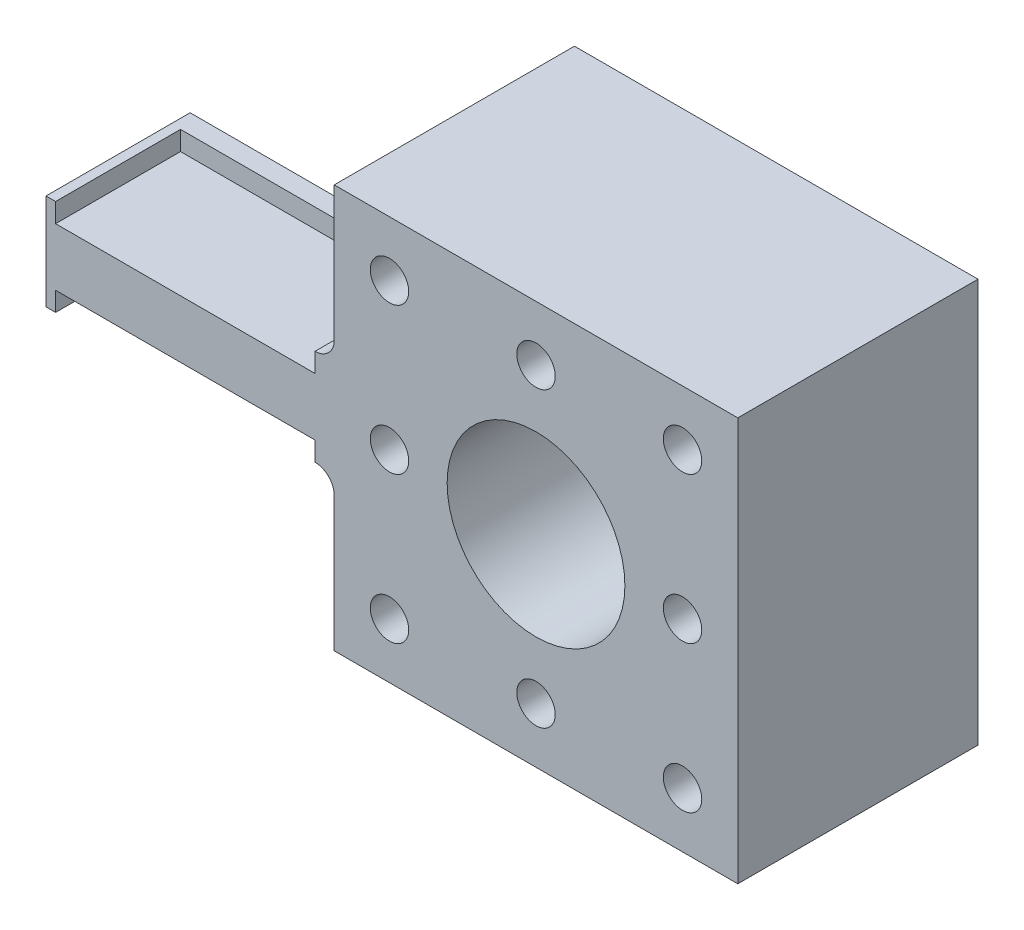
ISO-10303-21;
HEADER;
FILE_DESCRIPTION(('STEP AP214'),'2;1');
FILE_NAME('part.step','',(''),(''),'','','');
FILE_SCHEMA(('AUTOMOTIVE_DESIGN { 1 0 10303 214 1 1 1 1 }'));
ENDSEC;
DATA;
#1=APPLICATION_CONTEXT('core data for automotive mechanical design processes');
#2=APPLICATION_PROTOCOL_DEFINITION('international standard','automotive_design',2000,#1);
#3=PRODUCT_CONTEXT('',#1,'mechanical');
#4=PRODUCT('Part','Part','',(#3));
#5=PRODUCT_RELATED_PRODUCT_CATEGORY('part','',(#4));
#6=PRODUCT_DEFINITION_FORMATION('','',#4);
#7=PRODUCT_DEFINITION_CONTEXT('part definition',#1,'design');
#8=PRODUCT_DEFINITION('design','',#6,#7);
#9=PRODUCT_DEFINITION_SHAPE('','',#8);
#10=(LENGTH_UNIT() NAMED_UNIT(*) SI_UNIT(.MILLI.,.METRE.));
#11=(NAMED_UNIT(*) PLANE_ANGLE_UNIT() SI_UNIT($,.RADIAN.));
#12=(NAMED_UNIT(*) SI_UNIT($,.STERADIAN.) SOLID_ANGLE_UNIT());
#13=UNCERTAINTY_MEASURE_WITH_UNIT(LENGTH_MEASURE(1.E-05),#10,'distance_accuracy_value','');
#14=(GEOMETRIC_REPRESENTATION_CONTEXT(3) GLOBAL_UNCERTAINTY_ASSIGNED_CONTEXT((#13)) GLOBAL_UNIT_ASSIGNED_CONTEXT((#10,
#11,#12)) REPRESENTATION_CONTEXT('',''));
#15=CARTESIAN_POINT('',(0.,0.,0.));
#16=DIRECTION('',(0.,0.,1.));
#17=DIRECTION('',(1.,0.,0.));
#18=AXIS2_PLACEMENT_3D('',#15,#16,#17);
#19=CARTESIAN_POINT('',(0.,0.,25.));
#20=DIRECTION('',(1.,0.,0.));
#21=DIRECTION('',(0.,1.,0.));
#22=AXIS2_PLACEMENT_3D('',#19,#20,#21);
#23=PLANE('',#22);
#24=DIRECTION('',(0.,-1.,0.));
#25=VECTOR('',#24,1.);
#26=CARTESIAN_POINT('',(0.,-16.,10.));
#27=LINE('',#26,#25);
#28=CARTESIAN_POINT('',(0.,-14.,10.));
#29=VERTEX_POINT('',#28);
#30=CARTESIAN_POINT('',(0.,-28.,10.));
#31=VERTEX_POINT('',#30);
#32=EDGE_CURVE('E52',#29,#31,#27,.T.);
#33=ORIENTED_EDGE('',*,*,#32,.F.);
#34=DIRECTION('',(0.,0.,-1.));
#35=VECTOR('',#34,1.);
#36=CARTESIAN_POINT('',(0.,-14.,25.));
#37=LINE('',#36,#35);
#38=CARTESIAN_POINT('',(0.,-14.,25.));
#39=VERTEX_POINT('',#38);
#40=EDGE_CURVE('E333',#29,#39,#37,.F.);
#41=ORIENTED_EDGE('',*,*,#40,.T.);
#42=DIRECTION('',(0.,-1.,0.));
#43=VECTOR('',#42,1.);
#44=CARTESIAN_POINT('',(0.,0.,25.));
#45=LINE('',#44,#43);
#46=CARTESIAN_POINT('',(0.,0.,25.));
#47=VERTEX_POINT('',#46);
#48=EDGE_CURVE('E299',#47,#39,#45,.T.);
#49=ORIENTED_EDGE('',*,*,#48,.F.);
#50=DIRECTION('',(0.,0.,-1.));
#51=VECTOR('',#50,1.);
#52=CARTESIAN_POINT('',(0.,0.,25.));
#53=LINE('',#52,#51);
#54=CARTESIAN_POINT('',(0.,0.,0.));
#55=VERTEX_POINT('',#54);
#56=EDGE_CURVE('E309',#47,#55,#53,.T.);
#57=ORIENTED_EDGE('',*,*,#56,.T.);
#58=DIRECTION('',(0.,-1.,0.));
#59=VECTOR('',#58,1.);
#60=CARTESIAN_POINT('',(0.,0.,0.));
#61=LINE('',#60,#59);
#62=CARTESIAN_POINT('',(0.,-42.,0.));
#63=VERTEX_POINT('',#62);
#64=EDGE_CURVE('E296',#55,#63,#61,.T.);
#65=ORIENTED_EDGE('',*,*,#64,.T.);
#66=DIRECTION('',(0.,0.,-1.));
#67=VECTOR('',#66,1.);
#68=CARTESIAN_POINT('',(0.,-42.,25.));
#69=LINE('',#68,#67);
#70=CARTESIAN_POINT('',(0.,-42.,25.));
#71=VERTEX_POINT('',#70);
#72=EDGE_CURVE('E326',#71,#63,#69,.T.);
#73=ORIENTED_EDGE('',*,*,#72,.F.);
#74=CARTESIAN_POINT('',(0.,-28.,25.));
#75=VERTEX_POINT('',#74);
#76=EDGE_CURVE('E303',#75,#71,#45,.T.);
#77=ORIENTED_EDGE('',*,*,#76,.F.);
#78=DIRECTION('',(0.,0.,1.));
#79=VECTOR('',#78,1.);
#80=CARTESIAN_POINT('',(0.,-28.,10.));
#81=LINE('',#80,#79);
#82=EDGE_CURVE('E331',#75,#31,#81,.F.);
#83=ORIENTED_EDGE('',*,*,#82,.T.);
#84=EDGE_LOOP('',(#33,#41,#49,#57,#65,#73,#77,#83));
#85=FACE_BOUND('',#84,.T.);
#86=ADVANCED_FACE('F32',(#85),#23,.F.);
#87=CARTESIAN_POINT('',(0.,-42.,25.));
#88=DIRECTION('',(0.,1.,0.));
#89=DIRECTION('',(0.,0.,1.));
#90=AXIS2_PLACEMENT_3D('',#87,#88,#89);
#91=PLANE('',#90);
#92=DIRECTION('',(1.,0.,0.));
#93=VECTOR('',#92,1.);
#94=CARTESIAN_POINT('',(0.,-42.,0.));
#95=LINE('',#94,#93);
#96=CARTESIAN_POINT('',(42.,-42.,0.));
#97=VERTEX_POINT('',#96);
#98=EDGE_CURVE('E312',#63,#97,#95,.T.);
#99=ORIENTED_EDGE('',*,*,#98,.T.);
#100=DIRECTION('',(0.,0.,-1.));
#101=VECTOR('',#100,1.);
#102=CARTESIAN_POINT('',(42.,-42.,25.));
#103=LINE('',#102,#101);
#104=CARTESIAN_POINT('',(42.,-42.,25.));
#105=VERTEX_POINT('',#104);
#106=EDGE_CURVE('E323',#105,#97,#103,.T.);
#107=ORIENTED_EDGE('',*,*,#106,.F.);
#108=DIRECTION('',(1.,0.,0.));
#109=VECTOR('',#108,1.);
#110=CARTESIAN_POINT('',(0.,-42.,25.));
#111=LINE('',#110,#109);
#112=EDGE_CURVE('E302',#71,#105,#111,.T.);
#113=ORIENTED_EDGE('',*,*,#112,.F.);
#114=ORIENTED_EDGE('',*,*,#72,.T.);
#115=EDGE_LOOP('',(#99,#107,#113,#114));
#116=FACE_BOUND('',#115,.T.);
#117=ADVANCED_FACE('F381',(#116),#91,.F.);
#118=CARTESIAN_POINT('',(42.,0.,25.));
#119=DIRECTION('',(-1.,0.,0.));
#120=DIRECTION('',(0.,-1.,0.));
#121=AXIS2_PLACEMENT_3D('',#118,#119,#120);
#122=PLANE('',#121);
#123=DIRECTION('',(0.,1.,0.));
#124=VECTOR('',#123,1.);
#125=CARTESIAN_POINT('',(42.,0.,0.));
#126=LINE('',#125,#124);
#127=CARTESIAN_POINT('',(42.,0.,0.));
#128=VERTEX_POINT('',#127);
#129=EDGE_CURVE('E314',#97,#128,#126,.T.);
#130=ORIENTED_EDGE('',*,*,#129,.T.);
#131=DIRECTION('',(0.,0.,-1.));
#132=VECTOR('',#131,1.);
#133=CARTESIAN_POINT('',(42.,0.,25.));
#134=LINE('',#133,#132);
#135=CARTESIAN_POINT('',(42.,0.,25.));
#136=VERTEX_POINT('',#135);
#137=EDGE_CURVE('E320',#136,#128,#134,.T.);
#138=ORIENTED_EDGE('',*,*,#137,.F.);
#139=DIRECTION('',(0.,1.,0.));
#140=VECTOR('',#139,1.);
#141=CARTESIAN_POINT('',(42.,0.,25.));
#142=LINE('',#141,#140);
#143=EDGE_CURVE('E305',#105,#136,#142,.T.);
#144=ORIENTED_EDGE('',*,*,#143,.F.);
#145=ORIENTED_EDGE('',*,*,#106,.T.);
#146=EDGE_LOOP('',(#130,#138,#144,#145));
#147=FACE_BOUND('',#146,.T.);
#148=ADVANCED_FACE('F386',(#147),#122,.F.);
#149=CARTESIAN_POINT('',(0.,0.,25.));
#150=DIRECTION('',(0.,-1.,0.));
#151=DIRECTION('',(0.,0.,-1.));
#152=AXIS2_PLACEMENT_3D('',#149,#150,#151);
#153=PLANE('',#152);
#154=DIRECTION('',(-1.,0.,0.));
#155=VECTOR('',#154,1.);
#156=CARTESIAN_POINT('',(0.,0.,0.));
#157=LINE('',#156,#155);
#158=EDGE_CURVE('E316',#128,#55,#157,.T.);
#159=ORIENTED_EDGE('',*,*,#158,.T.);
#160=ORIENTED_EDGE('',*,*,#56,.F.);
#161=DIRECTION('',(-1.,0.,0.));
#162=VECTOR('',#161,1.);
#163=CARTESIAN_POINT('',(0.,0.,25.));
#164=LINE('',#163,#162);
#165=EDGE_CURVE('E307',#136,#47,#164,.T.);
#166=ORIENTED_EDGE('',*,*,#165,.F.);
#167=ORIENTED_EDGE('',*,*,#137,.T.);
#168=EDGE_LOOP('',(#159,#160,#166,#167));
#169=FACE_BOUND('',#168,.T.);
#170=ADVANCED_FACE('F478',(#169),#153,.F.);
#171=CARTESIAN_POINT('',(0.,0.,25.));
#172=DIRECTION('',(0.,0.,1.));
#173=DIRECTION('',(1.,0.,0.));
#174=AXIS2_PLACEMENT_3D('',#171,#172,#173);
#175=PLANE('',#174);
#176=DIRECTION('',(0.,1.,0.));
#177=VECTOR('',#176,1.);
#178=CARTESIAN_POINT('',(-29.,-18.,25.));
#179=LINE('',#178,#177);
#180=CARTESIAN_POINT('',(-29.,-18.,25.));
#181=VERTEX_POINT('',#180);
#182=CARTESIAN_POINT('',(-29.,-16.,25.));
#183=VERTEX_POINT('',#182);
#184=EDGE_CURVE('E150',#181,#183,#179,.T.);
#185=ORIENTED_EDGE('',*,*,#184,.T.);
#186=DIRECTION('',(1.,0.,0.));
#187=VECTOR('',#186,1.);
#188=CARTESIAN_POINT('',(-30.,-16.,25.));
#189=LINE('',#188,#187);
#190=CARTESIAN_POINT('',(-30.,-16.,25.));
#191=VERTEX_POINT('',#190);
#192=EDGE_CURVE('E242',#191,#183,#189,.T.);
#193=ORIENTED_EDGE('',*,*,#192,.F.);
#194=DIRECTION('',(0.,1.,0.));
#195=VECTOR('',#194,1.);
#196=CARTESIAN_POINT('',(-30.,-16.,25.));
#197=LINE('',#196,#195);
#198=CARTESIAN_POINT('',(-30.,-26.,25.));
#199=VERTEX_POINT('',#198);
#200=EDGE_CURVE('E223',#199,#191,#197,.T.);
#201=ORIENTED_EDGE('',*,*,#200,.F.);
#202=DIRECTION('',(1.,0.,0.));
#203=VECTOR('',#202,1.);
#204=CARTESIAN_POINT('',(-30.,-26.,25.));
#205=LINE('',#204,#203);
#206=CARTESIAN_POINT('',(-29.,-26.,25.));
#207=VERTEX_POINT('',#206);
#208=EDGE_CURVE('E233',#199,#207,#205,.T.);
#209=ORIENTED_EDGE('',*,*,#208,.T.);
#210=DIRECTION('',(0.,-1.,0.));
#211=VECTOR('',#210,1.);
#212=CARTESIAN_POINT('',(-29.,-24.,25.));
#213=LINE('',#212,#211);
#214=CARTESIAN_POINT('',(-29.,-24.,25.));
#215=VERTEX_POINT('',#214);
#216=EDGE_CURVE('E219',#215,#207,#213,.T.);
#217=ORIENTED_EDGE('',*,*,#216,.F.);
#218=DIRECTION('',(-1.,0.,0.));
#219=VECTOR('',#218,1.);
#220=CARTESIAN_POINT('',(-2.,-24.,25.));
#221=LINE('',#220,#219);
#222=CARTESIAN_POINT('',(-2.,-24.,25.));
#223=VERTEX_POINT('',#222);
#224=EDGE_CURVE('E197',#223,#215,#221,.T.);
#225=ORIENTED_EDGE('',*,*,#224,.F.);
#226=DIRECTION('',(0.,-1.,0.));
#227=VECTOR('',#226,1.);
#228=CARTESIAN_POINT('',(-2.,-24.,25.));
#229=LINE('',#228,#227);
#230=CARTESIAN_POINT('',(-2.,-26.,25.));
#231=VERTEX_POINT('',#230);
#232=EDGE_CURVE('E207',#223,#231,#229,.T.);
#233=ORIENTED_EDGE('',*,*,#232,.T.);
#234=CARTESIAN_POINT('',(-1.99999999999999,-28.,25.));
#235=DIRECTION('',(0.,0.,1.));
#236=DIRECTION('',(1.,0.,0.));
#237=AXIS2_PLACEMENT_3D('',#234,#235,#236);
#238=CIRCLE('',#237,2.);
#239=EDGE_CURVE('E40',#231,#75,#238,.F.);
#240=ORIENTED_EDGE('',*,*,#239,.T.);
#241=ORIENTED_EDGE('',*,*,#76,.T.);
#242=ORIENTED_EDGE('',*,*,#112,.T.);
#243=ORIENTED_EDGE('',*,*,#143,.T.);
#244=ORIENTED_EDGE('',*,*,#165,.T.);
#245=ORIENTED_EDGE('',*,*,#48,.T.);
#246=CARTESIAN_POINT('',(-2.,-14.,25.));
#247=DIRECTION('',(0.,0.,1.));
#248=DIRECTION('',(1.,0.,0.));
#249=AXIS2_PLACEMENT_3D('',#246,#247,#248);
#250=CIRCLE('',#249,2.);
#251=CARTESIAN_POINT('',(-2.,-16.,25.));
#252=VERTEX_POINT('',#251);
#253=EDGE_CURVE('E340',#39,#252,#250,.F.);
#254=ORIENTED_EDGE('',*,*,#253,.T.);
#255=DIRECTION('',(0.,1.,0.));
#256=VECTOR('',#255,1.);
#257=CARTESIAN_POINT('',(-2.,-18.,25.));
#258=LINE('',#257,#256);
#259=CARTESIAN_POINT('',(-2.,-18.,25.));
#260=VERTEX_POINT('',#259);
#261=EDGE_CURVE('E161',#260,#252,#258,.T.);
#262=ORIENTED_EDGE('',*,*,#261,.F.);
#263=DIRECTION('',(1.,0.,0.));
#264=VECTOR('',#263,1.);
#265=CARTESIAN_POINT('',(-29.,-18.,25.));
#266=LINE('',#265,#264);
#267=EDGE_CURVE('E168',#181,#260,#266,.T.);
#268=ORIENTED_EDGE('',*,*,#267,.F.);
#269=EDGE_LOOP('',(#185,#193,#201,#209,#217,#225,#233,#240,#241,#242,#243,#244,#245,#254,#262,#268));
#270=FACE_BOUND('',#269,.T.);
#271=CARTESIAN_POINT('',(21.,-36.25,25.));
#272=DIRECTION('',(0.,0.,1.));
#273=DIRECTION('',(1.,0.,0.));
#274=AXIS2_PLACEMENT_3D('',#271,#272,#273);
#275=CIRCLE('',#274,2.);
#276=CARTESIAN_POINT('',(23.,-36.25,25.));
#277=VERTEX_POINT('',#276);
#278=EDGE_CURVE('E261',#277,#277,#275,.T.);
#279=ORIENTED_EDGE('',*,*,#278,.F.);
#280=EDGE_LOOP('',(#279));
#281=FACE_BOUND('',#280,.T.);
#282=CARTESIAN_POINT('',(21.,-5.75000000000001,25.));
#283=DIRECTION('',(0.,0.,1.));
#284=DIRECTION('',(1.,0.,0.));
#285=AXIS2_PLACEMENT_3D('',#282,#283,#284);
#286=CIRCLE('',#285,2.);
#287=CARTESIAN_POINT('',(23.,-5.75000000000001,25.));
#288=VERTEX_POINT('',#287);
#289=EDGE_CURVE('E248',#288,#288,#286,.T.);
#290=ORIENTED_EDGE('',*,*,#289,.F.);
#291=EDGE_LOOP('',(#290));
#292=FACE_BOUND('',#291,.T.);
#293=CARTESIAN_POINT('',(36.25,-21.,25.));
#294=DIRECTION('',(0.,0.,1.));
#295=DIRECTION('',(1.,0.,0.));
#296=AXIS2_PLACEMENT_3D('',#293,#294,#295);
#297=CIRCLE('',#296,2.);
#298=CARTESIAN_POINT('',(38.25,-21.,25.));
#299=VERTEX_POINT('',#298);
#300=EDGE_CURVE('E249',#299,#299,#297,.T.);
#301=ORIENTED_EDGE('',*,*,#300,.F.);
#302=EDGE_LOOP('',(#301));
#303=FACE_BOUND('',#302,.T.);
#304=CARTESIAN_POINT('',(5.75000000000002,-21.,25.));
#305=DIRECTION('',(0.,0.,1.));
#306=DIRECTION('',(1.,0.,0.));
#307=AXIS2_PLACEMENT_3D('',#304,#305,#306);
#308=CIRCLE('',#307,2.);
#309=CARTESIAN_POINT('',(7.75000000000002,-21.,25.));
#310=VERTEX_POINT('',#309);
#311=EDGE_CURVE('E244',#310,#310,#308,.T.);
#312=ORIENTED_EDGE('',*,*,#311,.F.);
#313=EDGE_LOOP('',(#312));
#314=FACE_BOUND('',#313,.T.);
#315=CARTESIAN_POINT('',(5.75000000000002,-5.75,25.));
#316=DIRECTION('',(0.,0.,1.));
#317=DIRECTION('',(1.,0.,0.));
#318=AXIS2_PLACEMENT_3D('',#315,#316,#317);
#319=CIRCLE('',#318,2.);
#320=CARTESIAN_POINT('',(7.75000000000002,-5.75,25.));
#321=VERTEX_POINT('',#320);
#322=EDGE_CURVE('E260',#321,#321,#319,.T.);
#323=ORIENTED_EDGE('',*,*,#322,.F.);
#324=EDGE_LOOP('',(#323));
#325=FACE_BOUND('',#324,.T.);
#326=CARTESIAN_POINT('',(36.25,-5.75,25.));
#327=DIRECTION('',(0.,0.,1.));
#328=DIRECTION('',(1.,0.,0.));
#329=AXIS2_PLACEMENT_3D('',#326,#327,#328);
#330=CIRCLE('',#329,2.);
#331=CARTESIAN_POINT('',(38.25,-5.75,25.));
#332=VERTEX_POINT('',#331);
#333=EDGE_CURVE('E279',#332,#332,#330,.T.);
#334=ORIENTED_EDGE('',*,*,#333,.F.);
#335=EDGE_LOOP('',(#334));
#336=FACE_BOUND('',#335,.T.);
#337=CARTESIAN_POINT('',(5.75000000000002,-36.25,25.));
#338=DIRECTION('',(0.,0.,1.));
#339=DIRECTION('',(1.,0.,0.));
#340=AXIS2_PLACEMENT_3D('',#337,#338,#339);
#341=CIRCLE('',#340,2.00000000000001);
#342=CARTESIAN_POINT('',(7.75000000000002,-36.25,25.));
#343=VERTEX_POINT('',#342);
#344=EDGE_CURVE('E273',#343,#343,#341,.T.);
#345=ORIENTED_EDGE('',*,*,#344,.F.);
#346=EDGE_LOOP('',(#345));
#347=FACE_BOUND('',#346,.T.);
#348=CARTESIAN_POINT('',(36.25,-36.25,25.));
#349=DIRECTION('',(0.,0.,1.));
#350=DIRECTION('',(1.,0.,0.));
#351=AXIS2_PLACEMENT_3D('',#348,#349,#350);
#352=CIRCLE('',#351,2.00000000000001);
#353=CARTESIAN_POINT('',(38.25,-36.25,25.));
#354=VERTEX_POINT('',#353);
#355=EDGE_CURVE('E272',#354,#354,#352,.T.);
#356=ORIENTED_EDGE('',*,*,#355,.F.);
#357=EDGE_LOOP('',(#356));
#358=FACE_BOUND('',#357,.T.);
#359=CARTESIAN_POINT('',(21.,-21.,25.));
#360=DIRECTION('',(0.,0.,1.));
#361=DIRECTION('',(1.,0.,0.));
#362=AXIS2_PLACEMENT_3D('',#359,#360,#361);
#363=CIRCLE('',#362,9.25);
#364=CARTESIAN_POINT('',(30.25,-21.,25.));
#365=VERTEX_POINT('',#364);
#366=EDGE_CURVE('E290',#365,#365,#363,.T.);
#367=ORIENTED_EDGE('',*,*,#366,.F.);
#368=EDGE_LOOP('',(#367));
#369=FACE_BOUND('',#368,.T.);
#370=ADVANCED_FACE('F173',(#270,#281,#292,#303,#314,#325,#336,#347,#358,#369),#175,.T.);
#371=CARTESIAN_POINT('',(0.,0.,0.));
#372=DIRECTION('',(0.,0.,1.));
#373=DIRECTION('',(1.,0.,0.));
#374=AXIS2_PLACEMENT_3D('',#371,#372,#373);
#375=PLANE('',#374);
#376=CARTESIAN_POINT('',(21.,-21.,0.));
#377=DIRECTION('',(0.,0.,1.));
#378=DIRECTION('',(1.,0.,0.));
#379=AXIS2_PLACEMENT_3D('',#376,#377,#378);
#380=CIRCLE('',#379,9.25);
#381=CARTESIAN_POINT('',(30.25,-21.,0.));
#382=VERTEX_POINT('',#381);
#383=EDGE_CURVE('E293',#382,#382,#380,.T.);
#384=ORIENTED_EDGE('',*,*,#383,.T.);
#385=EDGE_LOOP('',(#384));
#386=FACE_BOUND('',#385,.T.);
#387=ORIENTED_EDGE('',*,*,#64,.F.);
#388=ORIENTED_EDGE('',*,*,#158,.F.);
#389=ORIENTED_EDGE('',*,*,#129,.F.);
#390=ORIENTED_EDGE('',*,*,#98,.F.);
#391=EDGE_LOOP('',(#387,#388,#389,#390));
#392=FACE_BOUND('',#391,.T.);
#393=ADVANCED_FACE('F477',(#386,#392),#375,.F.);
#394=CARTESIAN_POINT('',(21.,-21.,0.));
#395=DIRECTION('',(0.,0.,1.));
#396=DIRECTION('',(1.,0.,0.));
#397=AXIS2_PLACEMENT_3D('',#394,#395,#396);
#398=CYLINDRICAL_SURFACE('',#397,9.25);
#399=ORIENTED_EDGE('',*,*,#383,.F.);
#400=EDGE_LOOP('',(#399));
#401=FACE_BOUND('',#400,.T.);
#402=ORIENTED_EDGE('',*,*,#366,.T.);
#403=EDGE_LOOP('',(#402));
#404=FACE_BOUND('',#403,.T.);
#405=ADVANCED_FACE('F630',(#401,#404),#398,.F.);
#406=CARTESIAN_POINT('',(36.25,-36.25,22.));
#407=DIRECTION('',(0.,0.,1.));
#408=DIRECTION('',(1.,0.,0.));
#409=AXIS2_PLACEMENT_3D('',#406,#407,#408);
#410=CYLINDRICAL_SURFACE('',#409,2.00000000000001);
#411=CARTESIAN_POINT('',(36.25,-36.25,22.));
#412=DIRECTION('',(0.,0.,1.));
#413=DIRECTION('',(1.,0.,0.));
#414=AXIS2_PLACEMENT_3D('',#411,#412,#413);
#415=CIRCLE('',#414,2.00000000000001);
#416=CARTESIAN_POINT('',(38.25,-36.25,22.));
#417=VERTEX_POINT('',#416);
#418=EDGE_CURVE('E287',#417,#417,#415,.T.);
#419=ORIENTED_EDGE('',*,*,#418,.F.);
#420=EDGE_LOOP('',(#419));
#421=FACE_BOUND('',#420,.T.);
#422=ORIENTED_EDGE('',*,*,#355,.T.);
#423=EDGE_LOOP('',(#422));
#424=FACE_BOUND('',#423,.T.);
#425=ADVANCED_FACE('F622',(#421,#424),#410,.F.);
#426=CARTESIAN_POINT('',(36.25,-36.25,22.));
#427=DIRECTION('',(0.,0.,1.));
#428=DIRECTION('',(1.,0.,0.));
#429=AXIS2_PLACEMENT_3D('',#426,#427,#428);
#430=PLANE('',#429);
#431=ORIENTED_EDGE('',*,*,#418,.T.);
#432=EDGE_LOOP('',(#431));
#433=FACE_BOUND('',#432,.T.);
#434=ADVANCED_FACE('F614',(#433),#430,.T.);
#435=CARTESIAN_POINT('',(5.75000000000002,-36.25,22.));
#436=DIRECTION('',(0.,0.,1.));
#437=DIRECTION('',(1.,0.,0.));
#438=AXIS2_PLACEMENT_3D('',#435,#436,#437);
#439=CYLINDRICAL_SURFACE('',#438,2.00000000000001);
#440=CARTESIAN_POINT('',(5.75000000000002,-36.25,22.));
#441=DIRECTION('',(0.,0.,1.));
#442=DIRECTION('',(1.,0.,0.));
#443=AXIS2_PLACEMENT_3D('',#440,#441,#442);
#444=CIRCLE('',#443,2.00000000000001);
#445=CARTESIAN_POINT('',(7.75000000000002,-36.25,22.));
#446=VERTEX_POINT('',#445);
#447=EDGE_CURVE('E269',#446,#446,#444,.T.);
#448=ORIENTED_EDGE('',*,*,#447,.F.);
#449=EDGE_LOOP('',(#448));
#450=FACE_BOUND('',#449,.T.);
#451=ORIENTED_EDGE('',*,*,#344,.T.);
#452=EDGE_LOOP('',(#451));
#453=FACE_BOUND('',#452,.T.);
#454=ADVANCED_FACE('F606',(#450,#453),#439,.F.);
#455=CARTESIAN_POINT('',(5.75000000000002,-36.25,22.));
#456=DIRECTION('',(0.,0.,1.));
#457=DIRECTION('',(1.,0.,0.));
#458=AXIS2_PLACEMENT_3D('',#455,#456,#457);
#459=PLANE('',#458);
#460=ORIENTED_EDGE('',*,*,#447,.T.);
#461=EDGE_LOOP('',(#460));
#462=FACE_BOUND('',#461,.T.);
#463=ADVANCED_FACE('F598',(#462),#459,.T.);
#464=CARTESIAN_POINT('',(36.25,-5.75,22.));
#465=DIRECTION('',(0.,0.,1.));
#466=DIRECTION('',(1.,0.,0.));
#467=AXIS2_PLACEMENT_3D('',#464,#465,#466);
#468=CYLINDRICAL_SURFACE('',#467,2.);
#469=CARTESIAN_POINT('',(36.25,-5.75,22.));
#470=DIRECTION('',(0.,0.,1.));
#471=DIRECTION('',(1.,0.,0.));
#472=AXIS2_PLACEMENT_3D('',#469,#470,#471);
#473=CIRCLE('',#472,2.);
#474=CARTESIAN_POINT('',(38.25,-5.75,22.));
#475=VERTEX_POINT('',#474);
#476=EDGE_CURVE('E276',#475,#475,#473,.T.);
#477=ORIENTED_EDGE('',*,*,#476,.F.);
#478=EDGE_LOOP('',(#477));
#479=FACE_BOUND('',#478,.T.);
#480=ORIENTED_EDGE('',*,*,#333,.T.);
#481=EDGE_LOOP('',(#480));
#482=FACE_BOUND('',#481,.T.);
#483=ADVANCED_FACE('F590',(#479,#482),#468,.F.);
#484=CARTESIAN_POINT('',(36.25,-5.75,22.));
#485=DIRECTION('',(0.,0.,1.));
#486=DIRECTION('',(1.,0.,0.));
#487=AXIS2_PLACEMENT_3D('',#484,#485,#486);
#488=PLANE('',#487);
#489=ORIENTED_EDGE('',*,*,#476,.T.);
#490=EDGE_LOOP('',(#489));
#491=FACE_BOUND('',#490,.T.);
#492=ADVANCED_FACE('F582',(#491),#488,.T.);
#493=CARTESIAN_POINT('',(5.75000000000002,-5.75,22.));
#494=DIRECTION('',(0.,0.,1.));
#495=DIRECTION('',(1.,0.,0.));
#496=AXIS2_PLACEMENT_3D('',#493,#494,#495);
#497=CYLINDRICAL_SURFACE('',#496,2.);
#498=CARTESIAN_POINT('',(5.75000000000002,-5.75,22.));
#499=DIRECTION('',(0.,0.,1.));
#500=DIRECTION('',(1.,0.,0.));
#501=AXIS2_PLACEMENT_3D('',#498,#499,#500);
#502=CIRCLE('',#501,2.);
#503=CARTESIAN_POINT('',(7.75000000000002,-5.75,22.));
#504=VERTEX_POINT('',#503);
#505=EDGE_CURVE('E282',#504,#504,#502,.T.);
#506=ORIENTED_EDGE('',*,*,#505,.F.);
#507=EDGE_LOOP('',(#506));
#508=FACE_BOUND('',#507,.T.);
#509=ORIENTED_EDGE('',*,*,#322,.T.);
#510=EDGE_LOOP('',(#509));
#511=FACE_BOUND('',#510,.T.);
#512=ADVANCED_FACE('F574',(#508,#511),#497,.F.);
#513=CARTESIAN_POINT('',(5.75000000000002,-5.75,22.));
#514=DIRECTION('',(0.,0.,1.));
#515=DIRECTION('',(1.,0.,0.));
#516=AXIS2_PLACEMENT_3D('',#513,#514,#515);
#517=PLANE('',#516);
#518=ORIENTED_EDGE('',*,*,#505,.T.);
#519=EDGE_LOOP('',(#518));
#520=FACE_BOUND('',#519,.T.);
#521=ADVANCED_FACE('F566',(#520),#517,.T.);
#522=CARTESIAN_POINT('',(5.75000000000002,-21.,22.));
#523=DIRECTION('',(0.,0.,1.));
#524=DIRECTION('',(1.,0.,0.));
#525=AXIS2_PLACEMENT_3D('',#522,#523,#524);
#526=CYLINDRICAL_SURFACE('',#525,2.);
#527=CARTESIAN_POINT('',(5.75000000000002,-21.,22.));
#528=DIRECTION('',(0.,0.,1.));
#529=DIRECTION('',(1.,0.,0.));
#530=AXIS2_PLACEMENT_3D('',#527,#528,#529);
#531=CIRCLE('',#530,2.);
#532=CARTESIAN_POINT('',(7.75000000000002,-21.,22.));
#533=VERTEX_POINT('',#532);
#534=EDGE_CURVE('E252',#533,#533,#531,.T.);
#535=ORIENTED_EDGE('',*,*,#534,.F.);
#536=EDGE_LOOP('',(#535));
#537=FACE_BOUND('',#536,.T.);
#538=ORIENTED_EDGE('',*,*,#311,.T.);
#539=EDGE_LOOP('',(#538));
#540=FACE_BOUND('',#539,.T.);
#541=ADVANCED_FACE('F558',(#537,#540),#526,.F.);
#542=CARTESIAN_POINT('',(5.75000000000002,-21.,22.));
#543=DIRECTION('',(0.,0.,1.));
#544=DIRECTION('',(1.,0.,0.));
#545=AXIS2_PLACEMENT_3D('',#542,#543,#544);
#546=PLANE('',#545);
#547=ORIENTED_EDGE('',*,*,#534,.T.);
#548=EDGE_LOOP('',(#547));
#549=FACE_BOUND('',#548,.T.);
#550=ADVANCED_FACE('F550',(#549),#546,.T.);
#551=CARTESIAN_POINT('',(36.25,-21.,22.));
#552=DIRECTION('',(0.,0.,1.));
#553=DIRECTION('',(1.,0.,0.));
#554=AXIS2_PLACEMENT_3D('',#551,#552,#553);
#555=CYLINDRICAL_SURFACE('',#554,2.);
#556=CARTESIAN_POINT('',(36.25,-21.,22.));
#557=DIRECTION('',(0.,0.,1.));
#558=DIRECTION('',(1.,0.,0.));
#559=AXIS2_PLACEMENT_3D('',#556,#557,#558);
#560=CIRCLE('',#559,2.);
#561=CARTESIAN_POINT('',(38.25,-21.,22.));
#562=VERTEX_POINT('',#561);
#563=EDGE_CURVE('E245',#562,#562,#560,.T.);
#564=ORIENTED_EDGE('',*,*,#563,.F.);
#565=EDGE_LOOP('',(#564));
#566=FACE_BOUND('',#565,.T.);
#567=ORIENTED_EDGE('',*,*,#300,.T.);
#568=EDGE_LOOP('',(#567));
#569=FACE_BOUND('',#568,.T.);
#570=ADVANCED_FACE('F542',(#566,#569),#555,.F.);
#571=CARTESIAN_POINT('',(36.25,-21.,22.));
#572=DIRECTION('',(0.,0.,1.));
#573=DIRECTION('',(1.,0.,0.));
#574=AXIS2_PLACEMENT_3D('',#571,#572,#573);
#575=PLANE('',#574);
#576=ORIENTED_EDGE('',*,*,#563,.T.);
#577=EDGE_LOOP('',(#576));
#578=FACE_BOUND('',#577,.T.);
#579=ADVANCED_FACE('F534',(#578),#575,.T.);
#580=CARTESIAN_POINT('',(21.,-5.75000000000001,22.));
#581=DIRECTION('',(0.,0.,1.));
#582=DIRECTION('',(1.,0.,0.));
#583=AXIS2_PLACEMENT_3D('',#580,#581,#582);
#584=CYLINDRICAL_SURFACE('',#583,2.);
#585=CARTESIAN_POINT('',(21.,-5.75000000000001,22.));
#586=DIRECTION('',(0.,0.,1.));
#587=DIRECTION('',(1.,0.,0.));
#588=AXIS2_PLACEMENT_3D('',#585,#586,#587);
#589=CIRCLE('',#588,2.);
#590=CARTESIAN_POINT('',(23.,-5.75000000000001,22.));
#591=VERTEX_POINT('',#590);
#592=EDGE_CURVE('E264',#591,#591,#589,.T.);
#593=ORIENTED_EDGE('',*,*,#592,.F.);
#594=EDGE_LOOP('',(#593));
#595=FACE_BOUND('',#594,.T.);
#596=ORIENTED_EDGE('',*,*,#289,.T.);
#597=EDGE_LOOP('',(#596));
#598=FACE_BOUND('',#597,.T.);
#599=ADVANCED_FACE('F526',(#595,#598),#584,.F.);
#600=CARTESIAN_POINT('',(21.,-5.75000000000001,22.));
#601=DIRECTION('',(0.,0.,1.));
#602=DIRECTION('',(1.,0.,0.));
#603=AXIS2_PLACEMENT_3D('',#600,#601,#602);
#604=PLANE('',#603);
#605=ORIENTED_EDGE('',*,*,#592,.T.);
#606=EDGE_LOOP('',(#605));
#607=FACE_BOUND('',#606,.T.);
#608=ADVANCED_FACE('F518',(#607),#604,.T.);
#609=CARTESIAN_POINT('',(21.,-36.25,22.));
#610=DIRECTION('',(0.,0.,1.));
#611=DIRECTION('',(1.,0.,0.));
#612=AXIS2_PLACEMENT_3D('',#609,#610,#611);
#613=CYLINDRICAL_SURFACE('',#612,2.);
#614=CARTESIAN_POINT('',(21.,-36.25,22.));
#615=DIRECTION('',(0.,0.,1.));
#616=DIRECTION('',(1.,0.,0.));
#617=AXIS2_PLACEMENT_3D('',#614,#615,#616);
#618=CIRCLE('',#617,2.);
#619=CARTESIAN_POINT('',(23.,-36.25,22.));
#620=VERTEX_POINT('',#619);
#621=EDGE_CURVE('E257',#620,#620,#618,.T.);
#622=ORIENTED_EDGE('',*,*,#621,.F.);
#623=EDGE_LOOP('',(#622));
#624=FACE_BOUND('',#623,.T.);
#625=ORIENTED_EDGE('',*,*,#278,.T.);
#626=EDGE_LOOP('',(#625));
#627=FACE_BOUND('',#626,.T.);
#628=ADVANCED_FACE('F511',(#624,#627),#613,.F.);
#629=CARTESIAN_POINT('',(21.,-36.25,22.));
#630=DIRECTION('',(0.,0.,1.));
#631=DIRECTION('',(1.,0.,0.));
#632=AXIS2_PLACEMENT_3D('',#629,#630,#631);
#633=PLANE('',#632);
#634=ORIENTED_EDGE('',*,*,#621,.T.);
#635=EDGE_LOOP('',(#634));
#636=FACE_BOUND('',#635,.T.);
#637=ADVANCED_FACE('F377',(#636),#633,.T.);
#638=CARTESIAN_POINT('',(-30.,-16.,10.));
#639=DIRECTION('',(0.,-1.,0.));
#640=DIRECTION('',(1.,0.,0.));
#641=AXIS2_PLACEMENT_3D('',#638,#639,#640);
#642=PLANE('',#641);
#643=DIRECTION('',(-1.,0.,0.));
#644=VECTOR('',#643,1.);
#645=CARTESIAN_POINT('',(-29.,-16.,12.));
#646=LINE('',#645,#644);
#647=CARTESIAN_POINT('',(-2.,-16.,12.));
#648=VERTEX_POINT('',#647);
#649=CARTESIAN_POINT('',(-29.,-16.,12.));
#650=VERTEX_POINT('',#649);
#651=EDGE_CURVE('E171',#648,#650,#646,.T.);
#652=ORIENTED_EDGE('',*,*,#651,.F.);
#653=DIRECTION('',(0.,0.,-1.));
#654=VECTOR('',#653,1.);
#655=CARTESIAN_POINT('',(-2.,-16.,10.));
#656=LINE('',#655,#654);
#657=CARTESIAN_POINT('',(-2.,-16.,10.));
#658=VERTEX_POINT('',#657);
#659=EDGE_CURVE('E329',#648,#658,#656,.T.);
#660=ORIENTED_EDGE('',*,*,#659,.T.);
#661=DIRECTION('',(1.,0.,0.));
#662=VECTOR('',#661,1.);
#663=CARTESIAN_POINT('',(-30.,-16.,10.));
#664=LINE('',#663,#662);
#665=CARTESIAN_POINT('',(-30.,-16.,10.));
#666=VERTEX_POINT('',#665);
#667=EDGE_CURVE('E239',#666,#658,#664,.T.);
#668=ORIENTED_EDGE('',*,*,#667,.F.);
#669=DIRECTION('',(0.,0.,-1.));
#670=VECTOR('',#669,1.);
#671=CARTESIAN_POINT('',(-30.,-16.,10.));
#672=LINE('',#671,#670);
#673=EDGE_CURVE('E226',#191,#666,#672,.T.);
#674=ORIENTED_EDGE('',*,*,#673,.F.);
#675=ORIENTED_EDGE('',*,*,#192,.T.);
#676=DIRECTION('',(0.,0.,1.));
#677=VECTOR('',#676,1.);
#678=CARTESIAN_POINT('',(-29.,-16.,12.));
#679=LINE('',#678,#677);
#680=EDGE_CURVE('E156',#650,#183,#679,.T.);
#681=ORIENTED_EDGE('',*,*,#680,.F.);
#682=EDGE_LOOP('',(#652,#660,#668,#674,#675,#681));
#683=FACE_BOUND('',#682,.T.);
#684=ADVANCED_FACE('F370',(#683),#642,.F.);
#685=CARTESIAN_POINT('',(-30.,-16.,10.));
#686=DIRECTION('',(0.,0.,1.));
#687=DIRECTION('',(0.,-1.,0.));
#688=AXIS2_PLACEMENT_3D('',#685,#686,#687);
#689=PLANE('',#688);
#690=ORIENTED_EDGE('',*,*,#32,.T.);
#691=CARTESIAN_POINT('',(-1.99999999999999,-28.,10.));
#692=DIRECTION('',(0.,0.,1.));
#693=DIRECTION('',(0.,-1.,0.));
#694=AXIS2_PLACEMENT_3D('',#691,#692,#693);
#695=CIRCLE('',#694,2.);
#696=CARTESIAN_POINT('',(-1.99999999999999,-26.,10.));
#697=VERTEX_POINT('',#696);
#698=EDGE_CURVE('E11',#31,#697,#695,.T.);
#699=ORIENTED_EDGE('',*,*,#698,.T.);
#700=DIRECTION('',(1.,0.,0.));
#701=VECTOR('',#700,1.);
#702=CARTESIAN_POINT('',(-30.,-26.,10.));
#703=LINE('',#702,#701);
#704=CARTESIAN_POINT('',(-30.,-26.,10.));
#705=VERTEX_POINT('',#704);
#706=EDGE_CURVE('E237',#705,#697,#703,.T.);
#707=ORIENTED_EDGE('',*,*,#706,.F.);
#708=DIRECTION('',(0.,-1.,0.));
#709=VECTOR('',#708,1.);
#710=CARTESIAN_POINT('',(-30.,-16.,10.));
#711=LINE('',#710,#709);
#712=EDGE_CURVE('E228',#666,#705,#711,.T.);
#713=ORIENTED_EDGE('',*,*,#712,.F.);
#714=ORIENTED_EDGE('',*,*,#667,.T.);
#715=CARTESIAN_POINT('',(-2.,-14.,10.));
#716=DIRECTION('',(0.,0.,1.));
#717=DIRECTION('',(0.,-1.,0.));
#718=AXIS2_PLACEMENT_3D('',#715,#716,#717);
#719=CIRCLE('',#718,2.);
#720=EDGE_CURVE('E338',#658,#29,#719,.T.);
#721=ORIENTED_EDGE('',*,*,#720,.T.);
#722=EDGE_LOOP('',(#690,#699,#707,#713,#714,#721));
#723=FACE_BOUND('',#722,.T.);
#724=ADVANCED_FACE('F368',(#723),#689,.F.);
#725=CARTESIAN_POINT('',(-30.,-26.,25.));
#726=DIRECTION('',(0.,1.,0.));
#727=DIRECTION('',(-1.,0.,0.));
#728=AXIS2_PLACEMENT_3D('',#725,#726,#727);
#729=PLANE('',#728);
#730=ORIENTED_EDGE('',*,*,#706,.T.);
#731=DIRECTION('',(0.,0.,1.));
#732=VECTOR('',#731,1.);
#733=CARTESIAN_POINT('',(-2.,-26.,25.));
#734=LINE('',#733,#732);
#735=CARTESIAN_POINT('',(-2.,-26.,12.));
#736=VERTEX_POINT('',#735);
#737=EDGE_CURVE('E335',#697,#736,#734,.T.);
#738=ORIENTED_EDGE('',*,*,#737,.T.);
#739=DIRECTION('',(1.,0.,0.));
#740=VECTOR('',#739,1.);
#741=CARTESIAN_POINT('',(-2.,-26.,12.));
#742=LINE('',#741,#740);
#743=CARTESIAN_POINT('',(-29.,-26.,12.));
#744=VERTEX_POINT('',#743);
#745=EDGE_CURVE('E198',#744,#736,#742,.T.);
#746=ORIENTED_EDGE('',*,*,#745,.F.);
#747=DIRECTION('',(0.,0.,-1.));
#748=VECTOR('',#747,1.);
#749=CARTESIAN_POINT('',(-29.,-26.,12.));
#750=LINE('',#749,#748);
#751=EDGE_CURVE('E209',#207,#744,#750,.T.);
#752=ORIENTED_EDGE('',*,*,#751,.F.);
#753=ORIENTED_EDGE('',*,*,#208,.F.);
#754=DIRECTION('',(0.,0.,1.));
#755=VECTOR('',#754,1.);
#756=CARTESIAN_POINT('',(-30.,-26.,25.));
#757=LINE('',#756,#755);
#758=EDGE_CURVE('E230',#705,#199,#757,.T.);
#759=ORIENTED_EDGE('',*,*,#758,.F.);
#760=EDGE_LOOP('',(#730,#738,#746,#752,#753,#759));
#761=FACE_BOUND('',#760,.T.);
#762=ADVANCED_FACE('F351',(#761),#729,.F.);
#763=CARTESIAN_POINT('',(-30.,0.,0.));
#764=DIRECTION('',(1.,0.,0.));
#765=DIRECTION('',(0.,1.,0.));
#766=AXIS2_PLACEMENT_3D('',#763,#764,#765);
#767=PLANE('',#766);
#768=ORIENTED_EDGE('',*,*,#200,.T.);
#769=ORIENTED_EDGE('',*,*,#673,.T.);
#770=ORIENTED_EDGE('',*,*,#712,.T.);
#771=ORIENTED_EDGE('',*,*,#758,.T.);
#772=EDGE_LOOP('',(#768,#769,#770,#771));
#773=FACE_BOUND('',#772,.T.);
#774=ADVANCED_FACE('F365',(#773),#767,.F.);
#775=CARTESIAN_POINT('',(-2.,-24.,12.));
#776=DIRECTION('',(1.,0.,0.));
#777=DIRECTION('',(0.,1.,0.));
#778=AXIS2_PLACEMENT_3D('',#775,#776,#777);
#779=PLANE('',#778);
#780=DIRECTION('',(0.,0.,1.));
#781=VECTOR('',#780,1.);
#782=CARTESIAN_POINT('',(-2.,-26.,12.));
#783=LINE('',#782,#781);
#784=EDGE_CURVE('E189',#736,#231,#783,.T.);
#785=ORIENTED_EDGE('',*,*,#784,.T.);
#786=ORIENTED_EDGE('',*,*,#232,.F.);
#787=DIRECTION('',(0.,0.,1.));
#788=VECTOR('',#787,1.);
#789=CARTESIAN_POINT('',(-2.,-24.,12.));
#790=LINE('',#789,#788);
#791=CARTESIAN_POINT('',(-2.,-24.,12.));
#792=VERTEX_POINT('',#791);
#793=EDGE_CURVE('E194',#792,#223,#790,.T.);
#794=ORIENTED_EDGE('',*,*,#793,.F.);
#795=DIRECTION('',(0.,-1.,0.));
#796=VECTOR('',#795,1.);
#797=CARTESIAN_POINT('',(-2.,-24.,12.));
#798=LINE('',#797,#796);
#799=EDGE_CURVE('E214',#792,#736,#798,.T.);
#800=ORIENTED_EDGE('',*,*,#799,.T.);
#801=EDGE_LOOP('',(#785,#786,#794,#800));
#802=FACE_BOUND('',#801,.T.);
#803=ADVANCED_FACE('F356',(#802),#779,.F.);
#804=CARTESIAN_POINT('',(-2.,-24.,12.));
#805=DIRECTION('',(0.,0.,-1.));
#806=DIRECTION('',(0.,1.,0.));
#807=AXIS2_PLACEMENT_3D('',#804,#805,#806);
#808=PLANE('',#807);
#809=ORIENTED_EDGE('',*,*,#745,.T.);
#810=ORIENTED_EDGE('',*,*,#799,.F.);
#811=DIRECTION('',(1.,0.,0.));
#812=VECTOR('',#811,1.);
#813=CARTESIAN_POINT('',(-2.,-24.,12.));
#814=LINE('',#813,#812);
#815=CARTESIAN_POINT('',(-29.,-24.,12.));
#816=VERTEX_POINT('',#815);
#817=EDGE_CURVE('E204',#816,#792,#814,.T.);
#818=ORIENTED_EDGE('',*,*,#817,.F.);
#819=DIRECTION('',(0.,-1.,0.));
#820=VECTOR('',#819,1.);
#821=CARTESIAN_POINT('',(-29.,-24.,12.));
#822=LINE('',#821,#820);
#823=EDGE_CURVE('E217',#816,#744,#822,.T.);
#824=ORIENTED_EDGE('',*,*,#823,.T.);
#825=EDGE_LOOP('',(#809,#810,#818,#824));
#826=FACE_BOUND('',#825,.T.);
#827=ADVANCED_FACE('F359',(#826),#808,.F.);
#828=CARTESIAN_POINT('',(-29.,-24.,12.));
#829=DIRECTION('',(-1.,0.,0.));
#830=DIRECTION('',(0.,-1.,0.));
#831=AXIS2_PLACEMENT_3D('',#828,#829,#830);
#832=PLANE('',#831);
#833=ORIENTED_EDGE('',*,*,#751,.T.);
#834=ORIENTED_EDGE('',*,*,#823,.F.);
#835=DIRECTION('',(0.,0.,-1.));
#836=VECTOR('',#835,1.);
#837=CARTESIAN_POINT('',(-29.,-24.,12.));
#838=LINE('',#837,#836);
#839=EDGE_CURVE('E201',#215,#816,#838,.T.);
#840=ORIENTED_EDGE('',*,*,#839,.F.);
#841=ORIENTED_EDGE('',*,*,#216,.T.);
#842=EDGE_LOOP('',(#833,#834,#840,#841));
#843=FACE_BOUND('',#842,.T.);
#844=ADVANCED_FACE('F361',(#843),#832,.F.);
#845=CARTESIAN_POINT('',(0.,-24.,0.));
#846=DIRECTION('',(0.,-1.,0.));
#847=DIRECTION('',(0.,0.,-1.));
#848=AXIS2_PLACEMENT_3D('',#845,#846,#847);
#849=PLANE('',#848);
#850=ORIENTED_EDGE('',*,*,#793,.T.);
#851=ORIENTED_EDGE('',*,*,#224,.T.);
#852=ORIENTED_EDGE('',*,*,#839,.T.);
#853=ORIENTED_EDGE('',*,*,#817,.T.);
#854=EDGE_LOOP('',(#850,#851,#852,#853));
#855=FACE_BOUND('',#854,.T.);
#856=ADVANCED_FACE('F415',(#855),#849,.T.);
#857=CARTESIAN_POINT('',(-29.,-18.,12.));
#858=DIRECTION('',(-1.,0.,0.));
#859=DIRECTION('',(0.,-1.,0.));
#860=AXIS2_PLACEMENT_3D('',#857,#858,#859);
#861=PLANE('',#860);
#862=ORIENTED_EDGE('',*,*,#680,.T.);
#863=ORIENTED_EDGE('',*,*,#184,.F.);
#864=DIRECTION('',(0.,0.,1.));
#865=VECTOR('',#864,1.);
#866=CARTESIAN_POINT('',(-29.,-18.,12.));
#867=LINE('',#866,#865);
#868=CARTESIAN_POINT('',(-29.,-18.,12.));
#869=VERTEX_POINT('',#868);
#870=EDGE_CURVE('E153',#869,#181,#867,.T.);
#871=ORIENTED_EDGE('',*,*,#870,.F.);
#872=DIRECTION('',(0.,1.,0.));
#873=VECTOR('',#872,1.);
#874=CARTESIAN_POINT('',(-29.,-18.,12.));
#875=LINE('',#874,#873);
#876=EDGE_CURVE('E187',#869,#650,#875,.T.);
#877=ORIENTED_EDGE('',*,*,#876,.T.);
#878=EDGE_LOOP('',(#862,#863,#871,#877));
#879=FACE_BOUND('',#878,.T.);
#880=ADVANCED_FACE('F152',(#879),#861,.F.);
#881=CARTESIAN_POINT('',(-29.,-18.,12.));
#882=DIRECTION('',(0.,0.,-1.));
#883=DIRECTION('',(-1.,0.,0.));
#884=AXIS2_PLACEMENT_3D('',#881,#882,#883);
#885=PLANE('',#884);
#886=ORIENTED_EDGE('',*,*,#651,.T.);
#887=ORIENTED_EDGE('',*,*,#876,.F.);
#888=DIRECTION('',(-1.,0.,0.));
#889=VECTOR('',#888,1.);
#890=CARTESIAN_POINT('',(-29.,-18.,12.));
#891=LINE('',#890,#889);
#892=CARTESIAN_POINT('',(-2.,-18.,12.));
#893=VERTEX_POINT('',#892);
#894=EDGE_CURVE('E162',#893,#869,#891,.T.);
#895=ORIENTED_EDGE('',*,*,#894,.F.);
#896=DIRECTION('',(0.,1.,0.));
#897=VECTOR('',#896,1.);
#898=CARTESIAN_POINT('',(-2.,-18.,12.));
#899=LINE('',#898,#897);
#900=EDGE_CURVE('E190',#893,#648,#899,.T.);
#901=ORIENTED_EDGE('',*,*,#900,.T.);
#902=EDGE_LOOP('',(#886,#887,#895,#901));
#903=FACE_BOUND('',#902,.T.);
#904=ADVANCED_FACE('F407',(#903),#885,.F.);
#905=CARTESIAN_POINT('',(-2.,-18.,12.));
#906=DIRECTION('',(1.,0.,0.));
#907=DIRECTION('',(0.,0.,-1.));
#908=AXIS2_PLACEMENT_3D('',#905,#906,#907);
#909=PLANE('',#908);
#910=DIRECTION('',(0.,0.,-1.));
#911=VECTOR('',#910,1.);
#912=CARTESIAN_POINT('',(-2.,-16.,12.));
#913=LINE('',#912,#911);
#914=EDGE_CURVE('E182',#252,#648,#913,.T.);
#915=ORIENTED_EDGE('',*,*,#914,.T.);
#916=ORIENTED_EDGE('',*,*,#900,.F.);
#917=DIRECTION('',(0.,0.,-1.));
#918=VECTOR('',#917,1.);
#919=CARTESIAN_POINT('',(-2.,-18.,12.));
#920=LINE('',#919,#918);
#921=EDGE_CURVE('E176',#260,#893,#920,.T.);
#922=ORIENTED_EDGE('',*,*,#921,.F.);
#923=ORIENTED_EDGE('',*,*,#261,.T.);
#924=EDGE_LOOP('',(#915,#916,#922,#923));
#925=FACE_BOUND('',#924,.T.);
#926=ADVANCED_FACE('F397',(#925),#909,.F.);
#927=CARTESIAN_POINT('',(0.,-18.,0.));
#928=DIRECTION('',(0.,1.,0.));
#929=DIRECTION('',(-1.,0.,0.));
#930=AXIS2_PLACEMENT_3D('',#927,#928,#929);
#931=PLANE('',#930);
#932=ORIENTED_EDGE('',*,*,#870,.T.);
#933=ORIENTED_EDGE('',*,*,#267,.T.);
#934=ORIENTED_EDGE('',*,*,#921,.T.);
#935=ORIENTED_EDGE('',*,*,#894,.T.);
#936=EDGE_LOOP('',(#932,#933,#934,#935));
#937=FACE_BOUND('',#936,.T.);
#938=ADVANCED_FACE('F166',(#937),#931,.T.);
#939=CARTESIAN_POINT('',(-2.,-14.,10.));
#940=DIRECTION('',(0.,0.,1.));
#941=DIRECTION('',(1.,0.,0.));
#942=AXIS2_PLACEMENT_3D('',#939,#940,#941);
#943=CYLINDRICAL_SURFACE('',#942,2.);
#944=ORIENTED_EDGE('',*,*,#253,.F.);
#945=ORIENTED_EDGE('',*,*,#40,.F.);
#946=ORIENTED_EDGE('',*,*,#720,.F.);
#947=ORIENTED_EDGE('',*,*,#659,.F.);
#948=ORIENTED_EDGE('',*,*,#914,.F.);
#949=EDGE_LOOP('',(#944,#945,#946,#947,#948));
#950=FACE_BOUND('',#949,.T.);
#951=ADVANCED_FACE('F390',(#950),#943,.F.);
#952=CARTESIAN_POINT('',(-1.99999999999999,-28.,25.));
#953=DIRECTION('',(0.,0.,-1.));
#954=DIRECTION('',(-1.,0.,0.));
#955=AXIS2_PLACEMENT_3D('',#952,#953,#954);
#956=CYLINDRICAL_SURFACE('',#955,2.);
#957=ORIENTED_EDGE('',*,*,#698,.F.);
#958=ORIENTED_EDGE('',*,*,#82,.F.);
#959=ORIENTED_EDGE('',*,*,#239,.F.);
#960=ORIENTED_EDGE('',*,*,#784,.F.);
#961=ORIENTED_EDGE('',*,*,#737,.F.);
#962=EDGE_LOOP('',(#957,#958,#959,#960,#961));
#963=FACE_BOUND('',#962,.T.);
#964=ADVANCED_FACE('F34',(#963),#956,.F.);
#965=CLOSED_SHELL('',(#86,#117,#148,#170,#370,#393,#405,#425,#434,#454,#463,#483,#492,#512,#521,
#541,#550,#570,#579,#599,#608,#628,#637,#684,#724,#762,#774,#803,#827,#844,#856,#880,#904,#926,
#938,#951,#964));
#966=MANIFOLD_SOLID_BREP('B2',#965);
#967=ADVANCED_BREP_SHAPE_REPRESENTATION('',(#18,#966),#14);
#968=SHAPE_DEFINITION_REPRESENTATION(#9,#967);
ENDSEC;
END-ISO-10303-21;
